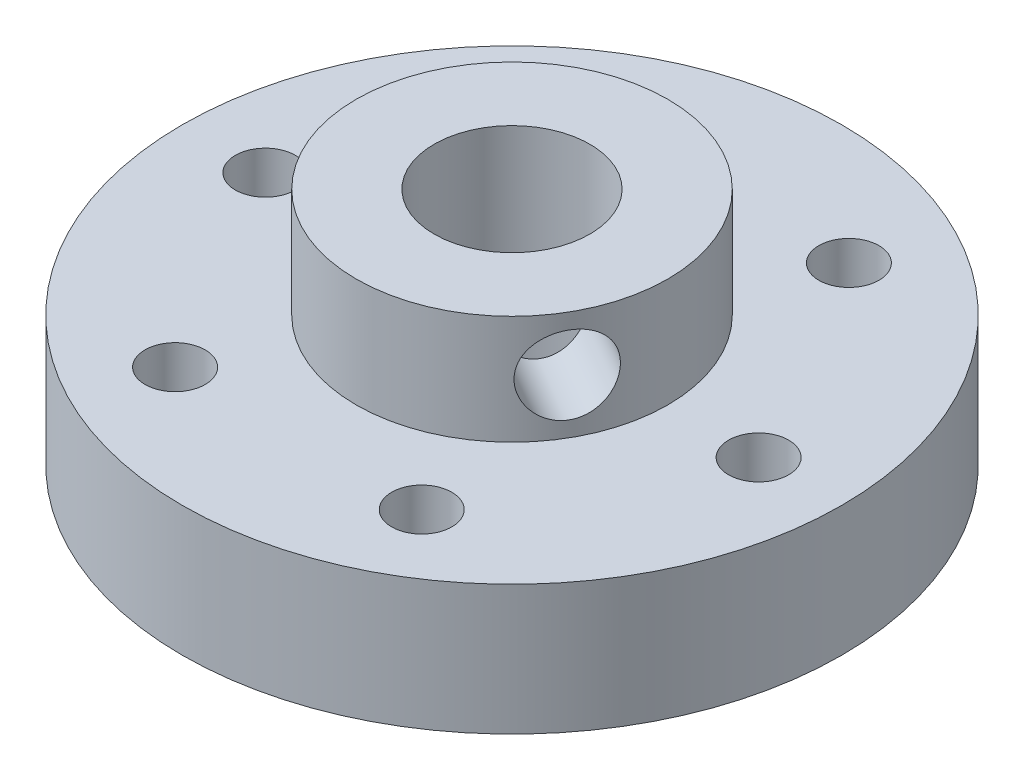
ISO-10303-21;
HEADER;
FILE_DESCRIPTION(('STEP AP214'),'2;1');
FILE_NAME('part.step','',(''),(''),'','','');
FILE_SCHEMA(('AUTOMOTIVE_DESIGN { 1 0 10303 214 1 1 1 1 }'));
ENDSEC;
DATA;
#1=APPLICATION_CONTEXT('core data for automotive mechanical design processes');
#2=APPLICATION_PROTOCOL_DEFINITION('international standard','automotive_design',2000,#1);
#3=PRODUCT_CONTEXT('',#1,'mechanical');
#4=PRODUCT('Part','Part','',(#3));
#5=PRODUCT_RELATED_PRODUCT_CATEGORY('part','',(#4));
#6=PRODUCT_DEFINITION_FORMATION('','',#4);
#7=PRODUCT_DEFINITION_CONTEXT('part definition',#1,'design');
#8=PRODUCT_DEFINITION('design','',#6,#7);
#9=PRODUCT_DEFINITION_SHAPE('','',#8);
#10=(LENGTH_UNIT() NAMED_UNIT(*) SI_UNIT(.MILLI.,.METRE.));
#11=(NAMED_UNIT(*) PLANE_ANGLE_UNIT() SI_UNIT($,.RADIAN.));
#12=(NAMED_UNIT(*) SI_UNIT($,.STERADIAN.) SOLID_ANGLE_UNIT());
#13=UNCERTAINTY_MEASURE_WITH_UNIT(LENGTH_MEASURE(1.E-05),#10,'distance_accuracy_value','');
#14=(GEOMETRIC_REPRESENTATION_CONTEXT(3) GLOBAL_UNCERTAINTY_ASSIGNED_CONTEXT((#13)) GLOBAL_UNIT_ASSIGNED_CONTEXT((#10,
#11,#12)) REPRESENTATION_CONTEXT('',''));
#15=CARTESIAN_POINT('',(0.,0.,0.));
#16=DIRECTION('',(0.,0.,1.));
#17=DIRECTION('',(1.,0.,0.));
#18=AXIS2_PLACEMENT_3D('',#15,#16,#17);
#19=CARTESIAN_POINT('',(0.,5.,0.));
#20=DIRECTION('',(0.,-1.,0.));
#21=DIRECTION('',(0.,0.,-1.));
#22=AXIS2_PLACEMENT_3D('',#19,#20,#21);
#23=CYLINDRICAL_SURFACE('',#22,12.7);
#24=CARTESIAN_POINT('',(0.,5.,0.));
#25=DIRECTION('',(0.,1.,0.));
#26=DIRECTION('',(0.,0.,1.));
#27=AXIS2_PLACEMENT_3D('',#24,#25,#26);
#28=CIRCLE('',#27,12.7);
#29=CARTESIAN_POINT('',(0.,5.,12.7));
#30=VERTEX_POINT('',#29);
#31=EDGE_CURVE('E10',#30,#30,#28,.T.);
#32=ORIENTED_EDGE('',*,*,#31,.F.);
#33=EDGE_LOOP('',(#32));
#34=FACE_BOUND('',#33,.T.);
#35=CARTESIAN_POINT('',(0.,0.,0.));
#36=DIRECTION('',(0.,1.,0.));
#37=DIRECTION('',(0.,0.,1.));
#38=AXIS2_PLACEMENT_3D('',#35,#36,#37);
#39=CIRCLE('',#38,12.7);
#40=CARTESIAN_POINT('',(0.,0.,12.7));
#41=VERTEX_POINT('',#40);
#42=EDGE_CURVE('E44',#41,#41,#39,.T.);
#43=ORIENTED_EDGE('',*,*,#42,.T.);
#44=EDGE_LOOP('',(#43));
#45=FACE_BOUND('',#44,.T.);
#46=ADVANCED_FACE('F33',(#34,#45),#23,.T.);
#47=CARTESIAN_POINT('',(0.,5.,0.));
#48=DIRECTION('',(0.,1.,0.));
#49=DIRECTION('',(0.,0.,1.));
#50=AXIS2_PLACEMENT_3D('',#47,#48,#49);
#51=PLANE('',#50);
#52=CARTESIAN_POINT('',(-4.7500000000001,5.,8.22724133595211));
#53=DIRECTION('',(0.,1.,0.));
#54=DIRECTION('',(0.,0.,1.));
#55=AXIS2_PLACEMENT_3D('',#52,#53,#54);
#56=CIRCLE('',#55,1.15817944162405);
#57=CARTESIAN_POINT('',(-4.7500000000001,5.,9.38542077757616));
#58=VERTEX_POINT('',#57);
#59=EDGE_CURVE('E93',#58,#58,#56,.T.);
#60=ORIENTED_EDGE('',*,*,#59,.F.);
#61=EDGE_LOOP('',(#60));
#62=FACE_BOUND('',#61,.T.);
#63=CARTESIAN_POINT('',(4.74999999999992,5.,8.22724133595221));
#64=DIRECTION('',(0.,1.,0.));
#65=DIRECTION('',(0.,0.,1.));
#66=AXIS2_PLACEMENT_3D('',#63,#64,#65);
#67=CIRCLE('',#66,1.15817944162405);
#68=CARTESIAN_POINT('',(4.74999999999992,5.,9.38542077757626));
#69=VERTEX_POINT('',#68);
#70=EDGE_CURVE('E87',#69,#69,#67,.T.);
#71=ORIENTED_EDGE('',*,*,#70,.F.);
#72=EDGE_LOOP('',(#71));
#73=FACE_BOUND('',#72,.T.);
#74=CARTESIAN_POINT('',(9.5,5.,0.));
#75=DIRECTION('',(0.,1.,0.));
#76=DIRECTION('',(0.,0.,1.));
#77=AXIS2_PLACEMENT_3D('',#74,#75,#76);
#78=CIRCLE('',#77,1.15817944162404);
#79=CARTESIAN_POINT('',(9.5,5.,1.15817944162411));
#80=VERTEX_POINT('',#79);
#81=EDGE_CURVE('E81',#80,#80,#78,.T.);
#82=ORIENTED_EDGE('',*,*,#81,.F.);
#83=EDGE_LOOP('',(#82));
#84=FACE_BOUND('',#83,.T.);
#85=CARTESIAN_POINT('',(4.75000000000004,5.,-8.22724133595215));
#86=DIRECTION('',(0.,1.,0.));
#87=DIRECTION('',(0.,0.,1.));
#88=AXIS2_PLACEMENT_3D('',#85,#86,#87);
#89=CIRCLE('',#88,1.15817944162404);
#90=CARTESIAN_POINT('',(4.75000000000004,5.,-7.0690618943281));
#91=VERTEX_POINT('',#90);
#92=EDGE_CURVE('E75',#91,#91,#89,.T.);
#93=ORIENTED_EDGE('',*,*,#92,.F.);
#94=EDGE_LOOP('',(#93));
#95=FACE_BOUND('',#94,.T.);
#96=CARTESIAN_POINT('',(-4.74999999999998,5.,-8.22724133595218));
#97=DIRECTION('',(0.,1.,0.));
#98=DIRECTION('',(0.,0.,1.));
#99=AXIS2_PLACEMENT_3D('',#96,#97,#98);
#100=CIRCLE('',#99,1.15817944162404);
#101=CARTESIAN_POINT('',(-4.74999999999998,5.,-7.06906189432813));
#102=VERTEX_POINT('',#101);
#103=EDGE_CURVE('E69',#102,#102,#100,.T.);
#104=ORIENTED_EDGE('',*,*,#103,.F.);
#105=EDGE_LOOP('',(#104));
#106=FACE_BOUND('',#105,.T.);
#107=CARTESIAN_POINT('',(-9.5,5.,0.));
#108=DIRECTION('',(0.,1.,0.));
#109=DIRECTION('',(0.,0.,1.));
#110=AXIS2_PLACEMENT_3D('',#107,#108,#109);
#111=CIRCLE('',#110,1.15817944162405);
#112=CARTESIAN_POINT('',(-9.5,5.,1.15817944162405));
#113=VERTEX_POINT('',#112);
#114=EDGE_CURVE('E63',#113,#113,#111,.T.);
#115=ORIENTED_EDGE('',*,*,#114,.F.);
#116=EDGE_LOOP('',(#115));
#117=FACE_BOUND('',#116,.T.);
#118=CARTESIAN_POINT('',(0.,5.,0.));
#119=DIRECTION('',(0.,1.,0.));
#120=DIRECTION('',(0.,0.,1.));
#121=AXIS2_PLACEMENT_3D('',#118,#119,#120);
#122=CIRCLE('',#121,6.);
#123=CARTESIAN_POINT('',(0.,5.,6.));
#124=VERTEX_POINT('',#123);
#125=EDGE_CURVE('E51',#124,#124,#122,.T.);
#126=ORIENTED_EDGE('',*,*,#125,.F.);
#127=EDGE_LOOP('',(#126));
#128=FACE_BOUND('',#127,.T.);
#129=ORIENTED_EDGE('',*,*,#31,.T.);
#130=EDGE_LOOP('',(#129));
#131=FACE_BOUND('',#130,.T.);
#132=ADVANCED_FACE('F151',(#62,#73,#84,#95,#106,#117,#128,#131),#51,.T.);
#133=CARTESIAN_POINT('',(0.,0.,0.));
#134=DIRECTION('',(0.,1.,0.));
#135=DIRECTION('',(0.,0.,1.));
#136=AXIS2_PLACEMENT_3D('',#133,#134,#135);
#137=PLANE('',#136);
#138=CARTESIAN_POINT('',(-4.7500000000001,0.,8.22724133595211));
#139=DIRECTION('',(0.,1.,0.));
#140=DIRECTION('',(0.,0.,1.));
#141=AXIS2_PLACEMENT_3D('',#138,#139,#140);
#142=CIRCLE('',#141,1.15817944162405);
#143=CARTESIAN_POINT('',(-4.7500000000001,0.,9.38542077757616));
#144=VERTEX_POINT('',#143);
#145=EDGE_CURVE('E90',#144,#144,#142,.T.);
#146=ORIENTED_EDGE('',*,*,#145,.T.);
#147=EDGE_LOOP('',(#146));
#148=FACE_BOUND('',#147,.T.);
#149=CARTESIAN_POINT('',(4.74999999999992,0.,8.22724133595221));
#150=DIRECTION('',(0.,1.,0.));
#151=DIRECTION('',(0.,0.,1.));
#152=AXIS2_PLACEMENT_3D('',#149,#150,#151);
#153=CIRCLE('',#152,1.15817944162405);
#154=CARTESIAN_POINT('',(4.74999999999992,0.,9.38542077757626));
#155=VERTEX_POINT('',#154);
#156=EDGE_CURVE('E84',#155,#155,#153,.T.);
#157=ORIENTED_EDGE('',*,*,#156,.T.);
#158=EDGE_LOOP('',(#157));
#159=FACE_BOUND('',#158,.T.);
#160=CARTESIAN_POINT('',(9.5,0.,0.));
#161=DIRECTION('',(0.,1.,0.));
#162=DIRECTION('',(0.,0.,1.));
#163=AXIS2_PLACEMENT_3D('',#160,#161,#162);
#164=CIRCLE('',#163,1.15817944162404);
#165=CARTESIAN_POINT('',(9.5,0.,1.15817944162411));
#166=VERTEX_POINT('',#165);
#167=EDGE_CURVE('E78',#166,#166,#164,.T.);
#168=ORIENTED_EDGE('',*,*,#167,.T.);
#169=EDGE_LOOP('',(#168));
#170=FACE_BOUND('',#169,.T.);
#171=CARTESIAN_POINT('',(4.75000000000004,0.,-8.22724133595215));
#172=DIRECTION('',(0.,1.,0.));
#173=DIRECTION('',(0.,0.,1.));
#174=AXIS2_PLACEMENT_3D('',#171,#172,#173);
#175=CIRCLE('',#174,1.15817944162404);
#176=CARTESIAN_POINT('',(4.75000000000004,0.,-7.0690618943281));
#177=VERTEX_POINT('',#176);
#178=EDGE_CURVE('E72',#177,#177,#175,.T.);
#179=ORIENTED_EDGE('',*,*,#178,.T.);
#180=EDGE_LOOP('',(#179));
#181=FACE_BOUND('',#180,.T.);
#182=CARTESIAN_POINT('',(-4.74999999999998,0.,-8.22724133595218));
#183=DIRECTION('',(0.,1.,0.));
#184=DIRECTION('',(0.,0.,1.));
#185=AXIS2_PLACEMENT_3D('',#182,#183,#184);
#186=CIRCLE('',#185,1.15817944162404);
#187=CARTESIAN_POINT('',(-4.74999999999998,0.,-7.06906189432813));
#188=VERTEX_POINT('',#187);
#189=EDGE_CURVE('E66',#188,#188,#186,.T.);
#190=ORIENTED_EDGE('',*,*,#189,.T.);
#191=EDGE_LOOP('',(#190));
#192=FACE_BOUND('',#191,.T.);
#193=CARTESIAN_POINT('',(-9.5,0.,0.));
#194=DIRECTION('',(0.,1.,0.));
#195=DIRECTION('',(0.,0.,1.));
#196=AXIS2_PLACEMENT_3D('',#193,#194,#195);
#197=CIRCLE('',#196,1.15817944162405);
#198=CARTESIAN_POINT('',(-9.5,0.,1.15817944162405));
#199=VERTEX_POINT('',#198);
#200=EDGE_CURVE('E60',#199,#199,#197,.T.);
#201=ORIENTED_EDGE('',*,*,#200,.T.);
#202=EDGE_LOOP('',(#201));
#203=FACE_BOUND('',#202,.T.);
#204=CARTESIAN_POINT('',(0.,0.,0.));
#205=DIRECTION('',(0.,1.,0.));
#206=DIRECTION('',(0.,0.,1.));
#207=AXIS2_PLACEMENT_3D('',#204,#205,#206);
#208=CIRCLE('',#207,3.);
#209=CARTESIAN_POINT('',(0.,0.,3.));
#210=VERTEX_POINT('',#209);
#211=EDGE_CURVE('E54',#210,#210,#208,.T.);
#212=ORIENTED_EDGE('',*,*,#211,.T.);
#213=EDGE_LOOP('',(#212));
#214=FACE_BOUND('',#213,.T.);
#215=ORIENTED_EDGE('',*,*,#42,.F.);
#216=EDGE_LOOP('',(#215));
#217=FACE_BOUND('',#216,.T.);
#218=ADVANCED_FACE('F146',(#148,#159,#170,#181,#192,#203,#214,#217),#137,.F.);
#219=CARTESIAN_POINT('',(0.,9.2,0.));
#220=DIRECTION('',(0.,-1.,0.));
#221=DIRECTION('',(0.,0.,-1.));
#222=AXIS2_PLACEMENT_3D('',#219,#220,#221);
#223=CYLINDRICAL_SURFACE('',#222,6.);
#224=CARTESIAN_POINT('',(4.28115294937448,7.1,4.20377561533227));
#225=CARTESIAN_POINT('',(4.28115549515694,7.18283045055476,4.20377436830915));
#226=CARTESIAN_POINT('',(4.28614596854367,7.26568693920679,4.19870908599278));
#227=CARTESIAN_POINT('',(4.30581174186006,7.42902054690442,4.17853763919068));
#228=CARTESIAN_POINT('',(4.3204926782729,7.50949625268099,4.16342563096372));
#229=CARTESIAN_POINT('',(4.35865132058026,7.66568212291222,4.12345915542938));
#230=CARTESIAN_POINT('',(4.38211766926044,7.7413982932314,4.09861726438047));
#231=CARTESIAN_POINT('',(4.43657518011202,7.88618651152395,4.03960468079261));
#232=CARTESIAN_POINT('',(4.46756666174836,7.95525827724814,4.00543359219296));
#233=CARTESIAN_POINT('',(4.53622071929416,8.08631698715732,3.92752383610319));
#234=CARTESIAN_POINT('',(4.57400346167025,8.14813616021002,3.88360878186754));
#235=CARTESIAN_POINT('',(4.65403337846915,8.2614568366162,3.78733223455354));
#236=CARTESIAN_POINT('',(4.69628096970732,8.31295737537305,3.73496995264475));
#237=CARTESIAN_POINT('',(4.78400849393325,8.40486528057876,3.62193921091351));
#238=CARTESIAN_POINT('',(4.82952530352455,8.44510783289688,3.56116504666307));
#239=CARTESIAN_POINT('',(4.92132742216087,8.51228578649185,3.4331806072472));
#240=CARTESIAN_POINT('',(4.96761261677659,8.53922315114931,3.36597128343489));
#241=CARTESIAN_POINT('',(5.05819298560041,8.57848870074715,3.22820986062974));
#242=CARTESIAN_POINT('',(5.10250947884438,8.59110178659595,3.15775306267151));
#243=CARTESIAN_POINT('',(5.18859010617515,8.60225502756533,3.01422144574302));
#244=CARTESIAN_POINT('',(5.23035461670153,8.60079726332576,2.94114701543096));
#245=CARTESIAN_POINT('',(5.3092272485751,8.58405508984991,2.79620579598124));
#246=CARTESIAN_POINT('',(5.34641812916503,8.56907820496769,2.72434818986932));
#247=CARTESIAN_POINT('',(5.41642003618517,8.5262172379709,2.5823753404915));
#248=CARTESIAN_POINT('',(5.44923082934484,8.49833246877355,2.51226019018535));
#249=CARTESIAN_POINT('',(5.51032832760287,8.43019845758776,2.37528148661655));
#250=CARTESIAN_POINT('',(5.53857147674168,8.38983977320295,2.30845303727229));
#251=CARTESIAN_POINT('',(5.59007054049917,8.29798659253025,2.18079265167724));
#252=CARTESIAN_POINT('',(5.61332558604842,8.24649015886363,2.11996176136769));
#253=CARTESIAN_POINT('',(5.65553827001898,8.13217475481057,2.00468493741121));
#254=CARTESIAN_POINT('',(5.67436256625706,8.06908706459134,1.95045636898689));
#255=CARTESIAN_POINT('',(5.70716713502738,7.93424001587585,1.85227707704578));
#256=CARTESIAN_POINT('',(5.72114718116572,7.8624802523054,1.80832683391319));
#257=CARTESIAN_POINT('',(5.74465198493326,7.71182597951062,1.732216852274));
#258=CARTESIAN_POINT('',(5.75415481061079,7.63289856181208,1.70011531811393));
#259=CARTESIAN_POINT('',(5.76889853775334,7.47044871915413,1.64939831058094));
#260=CARTESIAN_POINT('',(5.77414035126664,7.38692728161012,1.63077995129524));
#261=CARTESIAN_POINT('',(5.78047092092326,7.22002429908613,1.60819494575618));
#262=CARTESIAN_POINT('',(5.78166571160223,7.13669732400222,1.60385430424988));
#263=CARTESIAN_POINT('',(5.78024333810209,6.9705068380531,1.60897298006817));
#264=CARTESIAN_POINT('',(5.77762652482712,6.88764328522926,1.61843102705705));
#265=CARTESIAN_POINT('',(5.76856171098547,6.72613144102718,1.65044301343148));
#266=CARTESIAN_POINT('',(5.76217709505092,6.64743636405749,1.6727801519747));
#267=CARTESIAN_POINT('',(5.7454239250092,6.49494112528899,1.72944247011384));
#268=CARTESIAN_POINT('',(5.7350548989565,6.4211415445668,1.76376906979393));
#269=CARTESIAN_POINT('',(5.70980896705129,6.27893523327959,1.84387441267398));
#270=CARTESIAN_POINT('',(5.69484761957252,6.21066269597414,1.88986460481745));
#271=CARTESIAN_POINT('',(5.66018220222365,6.08288698231919,1.99128184251216));
#272=CARTESIAN_POINT('',(5.64047735277839,6.02338525000996,2.04671043878789));
#273=CARTESIAN_POINT('',(5.5955213706136,5.91331337445743,2.1666415276391));
#274=CARTESIAN_POINT('',(5.57014379946684,5.86300396247071,2.23133635860073));
#275=CARTESIAN_POINT('',(5.51406152011165,5.77463847982925,2.36653189047098));
#276=CARTESIAN_POINT('',(5.48335708989753,5.73658177003507,2.43703228830199));
#277=CARTESIAN_POINT('',(5.41707733355804,5.67413237928324,2.58098821860752));
#278=CARTESIAN_POINT('',(5.38153942430572,5.64964142937256,2.65441825443645));
#279=CARTESIAN_POINT('',(5.30602063373498,5.61472379923495,2.80232619711167));
#280=CARTESIAN_POINT('',(5.26604061147479,5.60429440475657,2.87680389892549));
#281=CARTESIAN_POINT('',(5.18378365151504,5.5979486156367,3.02244842239536));
#282=CARTESIAN_POINT('',(5.14159804745574,5.60164743635691,3.09365031610997));
#283=CARTESIAN_POINT('',(5.05526705282279,5.6225717409415,3.23279751240466));
#284=CARTESIAN_POINT('',(5.01112172057049,5.63979682251965,3.30074291177278));
#285=CARTESIAN_POINT('',(4.92264837971557,5.68707832965639,3.43128588415489));
#286=CARTESIAN_POINT('',(4.87832263389766,5.71706517997193,3.493910277456));
#287=CARTESIAN_POINT('',(4.7908999446629,5.78895586852899,3.61285654926644));
#288=CARTESIAN_POINT('',(4.74780315690063,5.83086120900435,3.66917763204426));
#289=CARTESIAN_POINT('',(4.66354228533356,5.92657285099561,3.77572530899636));
#290=CARTESIAN_POINT('',(4.62244923883638,5.98064021436106,3.82577357129563));
#291=CARTESIAN_POINT('',(4.54513701774415,6.0986342779607,3.91731122950228));
#292=CARTESIAN_POINT('',(4.50891908135848,6.16256347414686,3.95879845244697));
#293=CARTESIAN_POINT('',(4.44247535712897,6.299902121302,4.03323124589634));
#294=CARTESIAN_POINT('',(4.4123739638494,6.37346618511894,4.06600302451528));
#295=CARTESIAN_POINT('',(4.36068309607814,6.52708323488405,4.12139398840435));
#296=CARTESIAN_POINT('',(4.33908742963092,6.60713144916011,4.14402056079685));
#297=CARTESIAN_POINT('',(4.30882622980559,6.75586551774007,4.17545131118473));
#298=CARTESIAN_POINT('',(4.29848839344002,6.82383974657579,4.18605959683314));
#299=CARTESIAN_POINT('',(4.28465097826742,6.96120330349994,4.20022197050826));
#300=CARTESIAN_POINT('',(4.28115081614487,7.03059251036759,4.20377666027098));
#301=CARTESIAN_POINT('',(4.28115294937448,7.1,4.20377561533227));
#302=B_SPLINE_CURVE_WITH_KNOTS('',3,(#224,#225,#226,#227,#228,#229,#230,#231,#232,#233,#234,
#235,#236,#237,#238,#239,#240,#241,#242,#243,#244,#245,#246,#247,#248,#249,#250,#251,#252,#253,
#254,#255,#256,#257,#258,#259,#260,#261,#262,#263,#264,#265,#266,#267,#268,#269,#270,#271,#272,
#273,#274,#275,#276,#277,#278,#279,#280,#281,#282,#283,#284,#285,#286,#287,#288,#289,#290,#291,
#292,#293,#294,#295,#296,#297,#298,#299,#300,#301),.UNSPECIFIED.,.T.,.F.,(4,2,2,2,2,2,2,2,2,2,2,
2,2,2,2,2,2,2,2,2,2,2,2,2,2,2,2,2,2,2,2,2,2,2,2,2,2,2,4),(0.,0.248236465041681,
0.496617444857199,0.744678436299613,0.992749960532872,1.24574372515786,1.4987611288792,
1.75530897838752,2.01181895908255,2.26313250597208,2.51440889199612,2.76010957613368,
3.00582334034871,3.25375724552667,3.50173431281348,3.75642279943147,4.01112318719881,
4.26705859205041,4.52293920077728,4.7720614485703,5.02116076310281,5.26618443005524,
5.5112371285285,5.76109707515494,6.01099811331027,6.26715198579191,6.52329249431732,
6.77755243684157,7.03176329345423,7.27910067676474,7.52643070426188,7.77242925935826,
8.01845883442843,8.27038257949242,8.52237018939305,8.77905886370806,9.03556032819972,
9.24358696306398,9.45159585059712),.UNSPECIFIED.);
#303=CARTESIAN_POINT('',(4.28115294937448,7.1,4.20377561533227));
#304=VERTEX_POINT('',#303);
#305=EDGE_CURVE('E96',#304,#304,#302,.T.);
#306=ORIENTED_EDGE('',*,*,#305,.T.);
#307=EDGE_LOOP('',(#306));
#308=FACE_BOUND('',#307,.T.);
#309=CARTESIAN_POINT('',(0.,9.2,0.));
#310=DIRECTION('',(0.,1.,0.));
#311=DIRECTION('',(0.,0.,1.));
#312=AXIS2_PLACEMENT_3D('',#309,#310,#311);
#313=CIRCLE('',#312,6.);
#314=CARTESIAN_POINT('',(0.,9.2,6.));
#315=VERTEX_POINT('',#314);
#316=EDGE_CURVE('E49',#315,#315,#313,.T.);
#317=ORIENTED_EDGE('',*,*,#316,.F.);
#318=EDGE_LOOP('',(#317));
#319=FACE_BOUND('',#318,.T.);
#320=ORIENTED_EDGE('',*,*,#125,.T.);
#321=EDGE_LOOP('',(#320));
#322=FACE_BOUND('',#321,.T.);
#323=ADVANCED_FACE('F103',(#308,#319,#322),#223,.T.);
#324=CARTESIAN_POINT('',(0.,9.2,0.));
#325=DIRECTION('',(0.,1.,0.));
#326=DIRECTION('',(0.,0.,1.));
#327=AXIS2_PLACEMENT_3D('',#324,#325,#326);
#328=PLANE('',#327);
#329=CARTESIAN_POINT('',(0.,9.2,0.));
#330=DIRECTION('',(0.,1.,0.));
#331=DIRECTION('',(0.,0.,1.));
#332=AXIS2_PLACEMENT_3D('',#329,#330,#331);
#333=CIRCLE('',#332,3.);
#334=CARTESIAN_POINT('',(0.,9.2,3.));
#335=VERTEX_POINT('',#334);
#336=EDGE_CURVE('E57',#335,#335,#333,.T.);
#337=ORIENTED_EDGE('',*,*,#336,.F.);
#338=EDGE_LOOP('',(#337));
#339=FACE_BOUND('',#338,.T.);
#340=ORIENTED_EDGE('',*,*,#316,.T.);
#341=EDGE_LOOP('',(#340));
#342=FACE_BOUND('',#341,.T.);
#343=ADVANCED_FACE('F139',(#339,#342),#328,.T.);
#344=CARTESIAN_POINT('',(0.,0.,0.));
#345=DIRECTION('',(0.,1.,0.));
#346=DIRECTION('',(0.,0.,1.));
#347=AXIS2_PLACEMENT_3D('',#344,#345,#346);
#348=CYLINDRICAL_SURFACE('',#347,3.);
#349=CARTESIAN_POINT('',(1.49999999999997,7.1,2.59807621135333));
#350=CARTESIAN_POINT('',(1.50000862495777,7.02183828770712,2.59807489163535));
#351=CARTESIAN_POINT('',(1.50617609131308,6.94357788271243,2.59454052033291));
#352=CARTESIAN_POINT('',(1.53024117474816,6.78945910298427,2.58041553106383));
#353=CARTESIAN_POINT('',(1.54816343991201,6.71360612743489,2.56981008531853));
#354=CARTESIAN_POINT('',(1.59396640241375,6.56682250348409,2.54164960362353));
#355=CARTESIAN_POINT('',(1.62179412158729,6.49586802128962,2.5241314861918));
#356=CARTESIAN_POINT('',(1.68537217841438,6.35986369700492,2.48212970182896));
#357=CARTESIAN_POINT('',(1.72112294465763,6.29481417460631,2.45764565806234));
#358=CARTESIAN_POINT('',(1.80168953690996,6.16654140716374,2.39928825432992));
#359=CARTESIAN_POINT('',(1.84700983188557,6.10391129648968,2.36480703823353));
#360=CARTESIAN_POINT('',(1.94208348109411,5.98788741738993,2.28737222177591));
#361=CARTESIAN_POINT('',(1.99183902794256,5.93449825612472,2.24441441804236));
#362=CARTESIAN_POINT('',(2.09685921277505,5.8349492732785,2.14677761574318));
#363=CARTESIAN_POINT('',(2.15226912728262,5.7895193482107,2.09150371252973));
#364=CARTESIAN_POINT('',(2.26255337256747,5.71228872013135,1.97166528686269));
#365=CARTESIAN_POINT('',(2.31742801990065,5.68047941579424,1.90710666216056));
#366=CARTESIAN_POINT('',(2.41999926836364,5.63374300804835,1.77485215024178));
#367=CARTESIAN_POINT('',(2.46792879153451,5.6177757104667,1.70770635022692));
#368=CARTESIAN_POINT('',(2.5587467568802,5.59975082198744,1.56834812876342));
#369=CARTESIAN_POINT('',(2.60163823378902,5.59768481480643,1.49613879970136));
#370=CARTESIAN_POINT('',(2.67737164944846,5.60712001095552,1.35554572990429));
#371=CARTESIAN_POINT('',(2.71076315078898,5.61745702328183,1.28737537231281));
#372=CARTESIAN_POINT('',(2.77144236671132,5.64932126585698,1.15094836839949));
#373=CARTESIAN_POINT('',(2.79872962433119,5.67084933346433,1.08269171600205));
#374=CARTESIAN_POINT('',(2.84747758688165,5.72462384913472,0.947171644737));
#375=CARTESIAN_POINT('',(2.86885245562036,5.7570144697581,0.879935033322794));
#376=CARTESIAN_POINT('',(2.90571806648623,5.83139512430224,0.74927805597568));
#377=CARTESIAN_POINT('',(2.92120669671257,5.87338859495352,0.685859066607929));
#378=CARTESIAN_POINT('',(2.94829088935394,5.97034302729952,0.558742216123439));
#379=CARTESIAN_POINT('',(2.95938005266745,6.02615454248901,0.495584669819394));
#380=CARTESIAN_POINT('',(2.97671044952062,6.14688458739526,0.377816479613473));
#381=CARTESIAN_POINT('',(2.98294796407822,6.21181005841109,0.323212417851276));
#382=CARTESIAN_POINT('',(2.99227023377267,6.35397228863613,0.221560607904303));
#383=CARTESIAN_POINT('',(2.99512962226658,6.43172903458132,0.175212918700957));
#384=CARTESIAN_POINT('',(2.99867364292841,6.5944065070385,0.0974084034876492));
#385=CARTESIAN_POINT('',(2.99936054836896,6.67931964952634,0.0659360413893694));
#386=CARTESIAN_POINT('',(2.99999226031255,6.84682176692418,0.022200057336341));
#387=CARTESIAN_POINT('',(2.99999156123136,6.92906167856533,0.0086118691243394));
#388=CARTESIAN_POINT('',(3.00000545022047,7.09460201227481,-0.00262428191707109));
#389=CARTESIAN_POINT('',(3.00002002748602,7.17790164367968,-0.00028350465058441));
#390=CARTESIAN_POINT('',(2.99995130492037,7.33348087786809,0.0189620158629392));
#391=CARTESIAN_POINT('',(2.99987853752529,7.40596917666189,0.0342455816704387));
#392=CARTESIAN_POINT('',(2.99910450282201,7.54755167940644,0.0762192704439469));
#393=CARTESIAN_POINT('',(2.99840303189826,7.61664477611991,0.102913087334702));
#394=CARTESIAN_POINT('',(2.9954892487039,7.75311699635404,0.167747090108243));
#395=CARTESIAN_POINT('',(2.99320846621349,7.82026852528033,0.206360156164857));
#396=CARTESIAN_POINT('',(2.98599270210303,7.94820390730849,0.29279251384519));
#397=CARTESIAN_POINT('',(2.98105635500875,8.00898446526992,0.340616533553219));
#398=CARTESIAN_POINT('',(2.96657996164928,8.13046815128532,0.450372735397815));
#399=CARTESIAN_POINT('',(2.95653803437975,8.19019572607649,0.513323404573144));
#400=CARTESIAN_POINT('',(2.93026376448239,8.29911835699039,0.646661329675256));
#401=CARTESIAN_POINT('',(2.91402933593293,8.34830985534581,0.717051085649269));
#402=CARTESIAN_POINT('',(2.87366601779819,8.43586058892515,0.864905303918124));
#403=CARTESIAN_POINT('',(2.84934008652963,8.47389967731636,0.94250745224888));
#404=CARTESIAN_POINT('',(2.79222195919352,8.53570685578609,1.10023034944635));
#405=CARTESIAN_POINT('',(2.75943723357326,8.55948747704946,1.18034882144501));
#406=CARTESIAN_POINT('',(2.68899177768551,8.59005284626199,1.33255486537022));
#407=CARTESIAN_POINT('',(2.65205443487767,8.59819681381417,1.40470481159925));
#408=CARTESIAN_POINT('',(2.57227901151691,8.6012648981816,1.54594597206359));
#409=CARTESIAN_POINT('',(2.52944300157155,8.59619364278534,1.61503824843524));
#410=CARTESIAN_POINT('',(2.44242264231302,8.57387538980656,1.7436189550949));
#411=CARTESIAN_POINT('',(2.39851313854503,8.55745272611349,1.80344022145821));
#412=CARTESIAN_POINT('',(2.30851597393174,8.51400950104554,1.91729585296856));
#413=CARTESIAN_POINT('',(2.26242800155783,8.48698741985982,1.97132938681918));
#414=CARTESIAN_POINT('',(2.16780033494523,8.42190942175104,2.07503760165362));
#415=CARTESIAN_POINT('',(2.11924008859601,8.38343101518824,2.12442700907889));
#416=CARTESIAN_POINT('',(2.02353053115522,8.29706310371142,2.21578630362709));
#417=CARTESIAN_POINT('',(1.97638187960327,8.24916927632649,2.25775276611945));
#418=CARTESIAN_POINT('',(1.88089222171529,8.13980429146595,2.33805741522682));
#419=CARTESIAN_POINT('',(1.83289952499327,8.07745626878421,2.3756188678937));
#420=CARTESIAN_POINT('',(1.74357127017653,7.94382391830535,2.44193825832238));
#421=CARTESIAN_POINT('',(1.70224161222174,7.87253176869848,2.47068841372992));
#422=CARTESIAN_POINT('',(1.62795939102564,7.72004503012857,2.52027978123215));
#423=CARTESIAN_POINT('',(1.59531283502095,7.6386087033069,2.54084234346504));
#424=CARTESIAN_POINT('',(1.54341897250756,7.47000139349033,2.57270461210166));
#425=CARTESIAN_POINT('',(1.52412686979803,7.38285066663097,2.58403530875993));
#426=CARTESIAN_POINT('',(1.50843611970244,7.262291966522,2.593190178757));
#427=CARTESIAN_POINT('',(1.50528059539494,7.22994815840317,2.59502139928295));
#428=CARTESIAN_POINT('',(1.50106066990052,7.16507527897663,2.59746473112139));
#429=CARTESIAN_POINT('',(1.49999640860523,7.13254619542119,2.59807676087813));
#430=CARTESIAN_POINT('',(1.49999999999997,7.1,2.59807621135333));
#431=B_SPLINE_CURVE_WITH_KNOTS('',3,(#349,#350,#351,#352,#353,#354,#355,#356,#357,#358,#359,
#360,#361,#362,#363,#364,#365,#366,#367,#368,#369,#370,#371,#372,#373,#374,#375,#376,#377,#378,
#379,#380,#381,#382,#383,#384,#385,#386,#387,#388,#389,#390,#391,#392,#393,#394,#395,#396,#397,
#398,#399,#400,#401,#402,#403,#404,#405,#406,#407,#408,#409,#410,#411,#412,#413,#414,#415,#416,
#417,#418,#419,#420,#421,#422,#423,#424,#425,#426,#427,#428,#429,#430),.UNSPECIFIED.,.T.,.F.,(4,
2,2,2,2,2,2,2,2,2,2,2,2,2,2,2,2,2,2,2,2,2,2,2,2,2,2,2,2,2,2,2,2,2,2,2,2,2,2,2,4),(0.,
0.234348183892073,0.469189339237207,0.70279289387833,0.936409088167725,1.18929346874735,
1.44230356626556,1.71236838358145,1.98226240445836,2.23295227451903,2.4834903552906,
2.71224146226808,2.94100968776183,3.1729430209672,3.40495949025408,3.65890787185336,
3.91305072368878,4.18333262594173,4.45333161317557,4.70193436281318,4.9503613978256,
5.17161275136038,5.39293578654095,5.62450944609131,5.85620229330071,6.1171011537092,
6.37808797467303,6.64596272119449,6.91360169713157,7.1566840558423,7.39968130190957,
7.62666637307239,7.85368400268019,8.09041126079208,8.32724745151079,8.58765362775101,
8.84828914267731,9.11716123557907,9.38512699504141,9.48270202777964,9.58028358741811),.UNSPECIFIED.);
#432=CARTESIAN_POINT('',(1.49999999999997,7.1,2.59807621135333));
#433=VERTEX_POINT('',#432);
#434=EDGE_CURVE('E36',#433,#433,#431,.T.);
#435=ORIENTED_EDGE('',*,*,#434,.T.);
#436=EDGE_LOOP('',(#435));
#437=FACE_BOUND('',#436,.T.);
#438=ORIENTED_EDGE('',*,*,#211,.F.);
#439=EDGE_LOOP('',(#438));
#440=FACE_BOUND('',#439,.T.);
#441=ORIENTED_EDGE('',*,*,#336,.T.);
#442=EDGE_LOOP('',(#441));
#443=FACE_BOUND('',#442,.T.);
#444=ADVANCED_FACE('F135',(#437,#440,#443),#348,.F.);
#445=CARTESIAN_POINT('',(-9.5,0.,0.));
#446=DIRECTION('',(0.,1.,0.));
#447=DIRECTION('',(0.,0.,1.));
#448=AXIS2_PLACEMENT_3D('',#445,#446,#447);
#449=CYLINDRICAL_SURFACE('',#448,1.15817944162405);
#450=ORIENTED_EDGE('',*,*,#200,.F.);
#451=EDGE_LOOP('',(#450));
#452=FACE_BOUND('',#451,.T.);
#453=ORIENTED_EDGE('',*,*,#114,.T.);
#454=EDGE_LOOP('',(#453));
#455=FACE_BOUND('',#454,.T.);
#456=ADVANCED_FACE('F132',(#452,#455),#449,.F.);
#457=CARTESIAN_POINT('',(-4.74999999999998,0.,-8.22724133595218));
#458=DIRECTION('',(0.,1.,0.));
#459=DIRECTION('',(0.,0.,1.));
#460=AXIS2_PLACEMENT_3D('',#457,#458,#459);
#461=CYLINDRICAL_SURFACE('',#460,1.15817944162404);
#462=ORIENTED_EDGE('',*,*,#189,.F.);
#463=EDGE_LOOP('',(#462));
#464=FACE_BOUND('',#463,.T.);
#465=ORIENTED_EDGE('',*,*,#103,.T.);
#466=EDGE_LOOP('',(#465));
#467=FACE_BOUND('',#466,.T.);
#468=ADVANCED_FACE('F128',(#464,#467),#461,.F.);
#469=CARTESIAN_POINT('',(4.75000000000004,0.,-8.22724133595215));
#470=DIRECTION('',(0.,1.,0.));
#471=DIRECTION('',(0.,0.,1.));
#472=AXIS2_PLACEMENT_3D('',#469,#470,#471);
#473=CYLINDRICAL_SURFACE('',#472,1.15817944162404);
#474=ORIENTED_EDGE('',*,*,#178,.F.);
#475=EDGE_LOOP('',(#474));
#476=FACE_BOUND('',#475,.T.);
#477=ORIENTED_EDGE('',*,*,#92,.T.);
#478=EDGE_LOOP('',(#477));
#479=FACE_BOUND('',#478,.T.);
#480=ADVANCED_FACE('F124',(#476,#479),#473,.F.);
#481=CARTESIAN_POINT('',(9.5,0.,0.));
#482=DIRECTION('',(0.,1.,0.));
#483=DIRECTION('',(0.,0.,1.));
#484=AXIS2_PLACEMENT_3D('',#481,#482,#483);
#485=CYLINDRICAL_SURFACE('',#484,1.15817944162404);
#486=ORIENTED_EDGE('',*,*,#167,.F.);
#487=EDGE_LOOP('',(#486));
#488=FACE_BOUND('',#487,.T.);
#489=ORIENTED_EDGE('',*,*,#81,.T.);
#490=EDGE_LOOP('',(#489));
#491=FACE_BOUND('',#490,.T.);
#492=ADVANCED_FACE('F120',(#488,#491),#485,.F.);
#493=CARTESIAN_POINT('',(4.74999999999992,0.,8.22724133595221));
#494=DIRECTION('',(0.,1.,0.));
#495=DIRECTION('',(0.,0.,1.));
#496=AXIS2_PLACEMENT_3D('',#493,#494,#495);
#497=CYLINDRICAL_SURFACE('',#496,1.15817944162405);
#498=ORIENTED_EDGE('',*,*,#156,.F.);
#499=EDGE_LOOP('',(#498));
#500=FACE_BOUND('',#499,.T.);
#501=ORIENTED_EDGE('',*,*,#70,.T.);
#502=EDGE_LOOP('',(#501));
#503=FACE_BOUND('',#502,.T.);
#504=ADVANCED_FACE('F116',(#500,#503),#497,.F.);
#505=CARTESIAN_POINT('',(-4.7500000000001,0.,8.22724133595211));
#506=DIRECTION('',(0.,1.,0.));
#507=DIRECTION('',(0.,0.,1.));
#508=AXIS2_PLACEMENT_3D('',#505,#506,#507);
#509=CYLINDRICAL_SURFACE('',#508,1.15817944162405);
#510=ORIENTED_EDGE('',*,*,#145,.F.);
#511=EDGE_LOOP('',(#510));
#512=FACE_BOUND('',#511,.T.);
#513=ORIENTED_EDGE('',*,*,#59,.T.);
#514=EDGE_LOOP('',(#513));
#515=FACE_BOUND('',#514,.T.);
#516=ADVANCED_FACE('F111',(#512,#515),#509,.F.);
#517=CARTESIAN_POINT('',(7.10140831103235,7.1,4.10000000000008));
#518=DIRECTION('',(-0.866025403784433,0.,-0.50000000000001));
#519=DIRECTION('',(-0.50000000000001,0.,0.866025403784433));
#520=AXIS2_PLACEMENT_3D('',#517,#518,#519);
#521=CYLINDRICAL_SURFACE('',#520,1.5);
#522=ORIENTED_EDGE('',*,*,#434,.F.);
#523=EDGE_LOOP('',(#522));
#524=FACE_BOUND('',#523,.T.);
#525=ORIENTED_EDGE('',*,*,#305,.F.);
#526=EDGE_LOOP('',(#525));
#527=FACE_BOUND('',#526,.T.);
#528=ADVANCED_FACE('F107',(#524,#527),#521,.F.);
#529=CLOSED_SHELL('',(#46,#132,#218,#323,#343,#444,#456,#468,#480,#492,#504,#516,#528));
#530=MANIFOLD_SOLID_BREP('B2',#529);
#531=ADVANCED_BREP_SHAPE_REPRESENTATION('',(#18,#530),#14);
#532=SHAPE_DEFINITION_REPRESENTATION(#9,#531);
ENDSEC;
END-ISO-10303-21;
